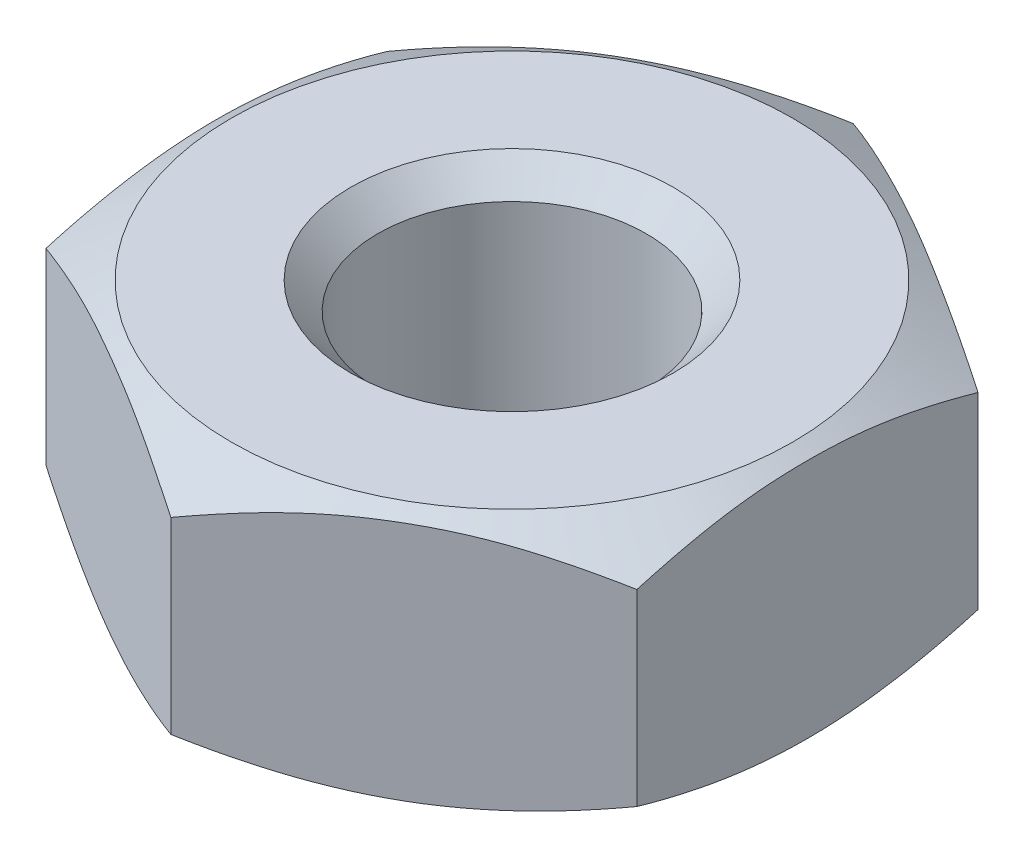
ISO-10303-21;
HEADER;
FILE_DESCRIPTION(('STEP AP214'),'2;1');
FILE_NAME('part.step','',(''),(''),'','','');
FILE_SCHEMA(('AUTOMOTIVE_DESIGN { 1 0 10303 214 1 1 1 1 }'));
ENDSEC;
DATA;
#1=APPLICATION_CONTEXT('core data for automotive mechanical design processes');
#2=APPLICATION_PROTOCOL_DEFINITION('international standard','automotive_design',2000,#1);
#3=PRODUCT_CONTEXT('',#1,'mechanical');
#4=PRODUCT('Part','Part','',(#3));
#5=PRODUCT_RELATED_PRODUCT_CATEGORY('part','',(#4));
#6=PRODUCT_DEFINITION_FORMATION('','',#4);
#7=PRODUCT_DEFINITION_CONTEXT('part definition',#1,'design');
#8=PRODUCT_DEFINITION('design','',#6,#7);
#9=PRODUCT_DEFINITION_SHAPE('','',#8);
#10=(LENGTH_UNIT() NAMED_UNIT(*) SI_UNIT(.MILLI.,.METRE.));
#11=(NAMED_UNIT(*) PLANE_ANGLE_UNIT() SI_UNIT($,.RADIAN.));
#12=(NAMED_UNIT(*) SI_UNIT($,.STERADIAN.) SOLID_ANGLE_UNIT());
#13=UNCERTAINTY_MEASURE_WITH_UNIT(LENGTH_MEASURE(1.E-05),#10,'distance_accuracy_value','');
#14=(GEOMETRIC_REPRESENTATION_CONTEXT(3) GLOBAL_UNCERTAINTY_ASSIGNED_CONTEXT((#13)) GLOBAL_UNIT_ASSIGNED_CONTEXT((#10,
#11,#12)) REPRESENTATION_CONTEXT('',''));
#15=CARTESIAN_POINT('',(0.,0.,0.));
#16=DIRECTION('',(0.,0.,1.));
#17=DIRECTION('',(1.,0.,0.));
#18=AXIS2_PLACEMENT_3D('',#15,#16,#17);
#19=CARTESIAN_POINT('',(2.75,0.,1.587713240271));
#20=DIRECTION('',(1.,0.,0.));
#21=DIRECTION('',(0.,1.,0.));
#22=AXIS2_PLACEMENT_3D('',#19,#20,#21);
#23=PLANE('',#22);
#24=DIRECTION('',(0.,1.,0.));
#25=VECTOR('',#24,1.);
#26=CARTESIAN_POINT('',(2.75000000001,0.3250057550854,1.587713240281));
#27=LINE('',#26,#25);
#28=CARTESIAN_POINT('',(2.75,0.3250057550754,1.587713240271));
#29=VERTEX_POINT('',#28);
#30=CARTESIAN_POINT('',(2.75,2.074994244925,1.587713240271));
#31=VERTEX_POINT('',#30);
#32=EDGE_CURVE('E41',#29,#31,#27,.T.);
#33=ORIENTED_EDGE('',*,*,#32,.F.);
#34=CARTESIAN_POINT('',(2.75,0.3250057550854,1.587713240281));
#35=CARTESIAN_POINT('',(2.75,0.202432964709957,1.16310863917238));
#36=CARTESIAN_POINT('',(2.75,0.141995276004106,0.779836988622892));
#37=CARTESIAN_POINT('',(2.75,0.0794641483916763,0.38328958577));
#38=CARTESIAN_POINT('',(2.75,0.079391833422988,0.));
#39=CARTESIAN_POINT('',(2.75,0.0793198580882929,-0.38148943049256));
#40=CARTESIAN_POINT('',(2.75,0.142034718955519,-0.780084679138575));
#41=CARTESIAN_POINT('',(2.75,0.20213982434293,-1.16209317115311));
#42=CARTESIAN_POINT('',(2.75,0.3250057550854,-1.587713240281));
#43=B_SPLINE_CURVE_WITH_KNOTS('',2,(#34,#35,#36,#37,#38,#39,#40,#41,#42),.UNSPECIFIED.,.F.,.F.,
(3,2,2,2,3),(0.,0.25,0.5,0.75,1.),.UNSPECIFIED.);
#44=CARTESIAN_POINT('',(2.75,0.3250057550754,-1.587713240271));
#45=VERTEX_POINT('',#44);
#46=EDGE_CURVE('E11',#29,#45,#43,.T.);
#47=ORIENTED_EDGE('',*,*,#46,.T.);
#48=DIRECTION('',(0.,1.,0.));
#49=VECTOR('',#48,1.);
#50=CARTESIAN_POINT('',(2.75000000001,0.3250057550854,-1.587713240281));
#51=LINE('',#50,#49);
#52=CARTESIAN_POINT('',(2.75,2.074994244925,-1.587713240271));
#53=VERTEX_POINT('',#52);
#54=EDGE_CURVE('E31',#45,#53,#51,.T.);
#55=ORIENTED_EDGE('',*,*,#54,.T.);
#56=CARTESIAN_POINT('',(2.74999999128452,2.07499422748405,1.58771323524335));
#57=CARTESIAN_POINT('',(2.75026924419332,2.0950517669424,1.51775006464995));
#58=CARTESIAN_POINT('',(2.75031743477077,2.11429358889751,1.44754296139929));
#59=CARTESIAN_POINT('',(2.75016073239949,2.15014362364269,1.30917614943761));
#60=CARTESIAN_POINT('',(2.74996495720855,2.16682205356569,1.24103456220994));
#61=CARTESIAN_POINT('',(2.74950953728605,2.19755391170657,1.10640623662916));
#62=CARTESIAN_POINT('',(2.74925208963847,2.21167329075243,1.03993467109337));
#63=CARTESIAN_POINT('',(2.74881881165998,2.23729045799972,0.90820653320835));
#64=CARTESIAN_POINT('',(2.74864110441468,2.24884488851676,0.842961050695181));
#65=CARTESIAN_POINT('',(2.74845083193915,2.26934378666009,0.713195722113406));
#66=CARTESIAN_POINT('',(2.74843550930952,2.27832930313306,0.648682408770343));
#67=CARTESIAN_POINT('',(2.74857872189258,2.29370818721281,0.519848842514658));
#68=CARTESIAN_POINT('',(2.74873592238204,2.30012093817181,0.455530913880747));
#69=CARTESIAN_POINT('',(2.74914812054111,2.31037706255383,0.326518511798419));
#70=CARTESIAN_POINT('',(2.74940337688466,2.31421356557101,0.261823491955182));
#71=CARTESIAN_POINT('',(2.74983109216155,2.31934811782021,0.13146051054192));
#72=CARTESIAN_POINT('',(2.75000238888214,2.32061125978377,0.0657911870760246));
#73=CARTESIAN_POINT('',(2.75000294166434,2.32061428398817,-0.0653518336409079));
#74=CARTESIAN_POINT('',(2.74983321604558,2.31936167845436,-0.13082553036676));
#75=CARTESIAN_POINT('',(2.7494411179775,2.31424296203845,-0.260854618884632));
#76=CARTESIAN_POINT('',(2.7492194279927,2.3104096161718,-0.325411286168579));
#77=CARTESIAN_POINT('',(2.74888257041347,2.30016131103028,-0.454205149844191));
#78=CARTESIAN_POINT('',(2.74876721666765,2.2937508915307,-0.518442707972161));
#79=CARTESIAN_POINT('',(2.74870648248435,2.27837650616623,-0.647174495889766));
#80=CARTESIAN_POINT('',(2.74876258329119,2.26939089847432,-0.711666127813049));
#81=CARTESIAN_POINT('',(2.74902031774506,2.24889195105121,-0.841447904794925));
#82=CARTESIAN_POINT('',(2.74922458392745,2.23733554587004,-0.906731194436827));
#83=CARTESIAN_POINT('',(2.74968493901144,2.21171410743799,-1.03859557577446));
#84=CARTESIAN_POINT('',(2.74994225690861,2.19759075083289,-1.10516525938946));
#85=CARTESIAN_POINT('',(2.75035848553218,2.1668503704069,-1.24005122978069));
#86=CARTESIAN_POINT('',(2.75051384313673,2.15016609213888,-1.30835207294491));
#87=CARTESIAN_POINT('',(2.75053785660167,2.11430300035224,-1.4470991158237));
#88=CARTESIAN_POINT('',(2.75039527346869,2.09505299636517,-1.51752697770114));
#89=CARTESIAN_POINT('',(2.74999999128452,2.07499422748405,-1.58771323524335));
#90=B_SPLINE_CURVE_WITH_KNOTS('',3,(#56,#57,#58,#59,#60,#61,#62,#63,#64,#65,#66,#67,#68,#69,#70,
#71,#72,#73,#74,#75,#76,#77,#78,#79,#80,#81,#82,#83,#84,#85,#86,#87,#88,#89),.UNSPECIFIED.,.F.,
.F.,(4,2,2,2,2,2,2,2,2,2,2,2,2,2,2,2,4),(0.,0.218353911222963,0.428786539417434,
0.632615578700071,0.831356640650916,1.02671742750199,1.22057739483245,1.41495232135759,
1.61194681703093,1.80835394581791,2.00231337616111,2.19593261421896,2.39122929791552,
2.59008367564735,2.7942035205356,3.00510434639758,3.22410416106754),.UNSPECIFIED.);
#91=EDGE_CURVE('E353',#31,#53,#90,.T.);
#92=ORIENTED_EDGE('',*,*,#91,.F.);
#93=EDGE_LOOP('',(#33,#47,#55,#92));
#94=FACE_BOUND('',#93,.T.);
#95=ADVANCED_FACE('F17',(#94),#23,.T.);
#96=CARTESIAN_POINT('',(0.,0.1625028775377,0.));
#97=DIRECTION('',(0.,1.,0.));
#98=DIRECTION('',(0.866025403784429,0.,0.500000000000017));
#99=AXIS2_PLACEMENT_3D('',#96,#97,#98);
#100=CONICAL_SURFACE('',#99,2.8939632,1.0471975512);
#101=CARTESIAN_POINT('',(-2.75,0.3250057550854,-1.587713240281));
#102=CARTESIAN_POINT('',(-2.75,0.202432964709957,-1.16310863917238));
#103=CARTESIAN_POINT('',(-2.75,0.141995276004106,-0.779836988622892));
#104=CARTESIAN_POINT('',(-2.75,0.0794641483916763,-0.38328958577));
#105=CARTESIAN_POINT('',(-2.75,0.079391833422988,0.));
#106=CARTESIAN_POINT('',(-2.75,0.0793198580882929,0.38148943049256));
#107=CARTESIAN_POINT('',(-2.75,0.142034718955519,0.780084679138575));
#108=CARTESIAN_POINT('',(-2.75,0.20213982434293,1.16209317115311));
#109=CARTESIAN_POINT('',(-2.75,0.3250057550854,1.587713240281));
#110=B_SPLINE_CURVE_WITH_KNOTS('',2,(#101,#102,#103,#104,#105,#106,#107,#108,#109),
.UNSPECIFIED.,.F.,.F.,(3,2,2,2,3),(0.,0.25,0.5,0.75,1.),.UNSPECIFIED.);
#111=CARTESIAN_POINT('',(-2.75,0.3250057550754,-1.587713240271));
#112=VERTEX_POINT('',#111);
#113=CARTESIAN_POINT('',(-2.75,0.3250057550754,1.587713240271));
#114=VERTEX_POINT('',#113);
#115=EDGE_CURVE('E86',#112,#114,#110,.T.);
#116=ORIENTED_EDGE('',*,*,#115,.F.);
#117=CARTESIAN_POINT('',(4.33020176524475E-12,0.3250057550854,-3.1754264805455));
#118=CARTESIAN_POINT('',(-0.36771837117246,0.202432964701767,-2.9631241799606));
#119=CARTESIAN_POINT('',(-0.699641357053544,0.141995276004106,-2.77148835471192));
#120=CARTESIAN_POINT('',(-1.0430614818358,0.0794641483721747,-2.57321465322374));
#121=CARTESIAN_POINT('',(-1.37513819265072,0.0793918334229927,-2.38149007484313));
#122=CARTESIAN_POINT('',(-1.70537995413911,0.0793199180630109,-2.19082490495015));
#123=CARTESIAN_POINT('',(-2.05057314923139,0.142034718955519,-1.99152752084118));
#124=CARTESIAN_POINT('',(-2.38140230645626,0.202139857236843,-1.80052321786162));
#125=CARTESIAN_POINT('',(-2.75000000000337,0.3250057550854,-1.58771324026951));
#126=B_SPLINE_CURVE_WITH_KNOTS('',2,(#117,#118,#119,#120,#121,#122,#123,#124,#125),
.UNSPECIFIED.,.F.,.F.,(3,2,2,2,3),(0.,0.25,0.5,0.75,1.),.UNSPECIFIED.);
#127=CARTESIAN_POINT('',(0.,0.3250057550754,-3.175426480543));
#128=VERTEX_POINT('',#127);
#129=EDGE_CURVE('E129',#128,#112,#126,.T.);
#130=ORIENTED_EDGE('',*,*,#129,.F.);
#131=CARTESIAN_POINT('',(2.75000000000317,0.3250057550854,-1.58771324026917));
#132=CARTESIAN_POINT('',(2.38228162887582,0.202432964709482,-1.80001554082552));
#133=CARTESIAN_POINT('',(2.05035864295268,0.141995276004106,-1.99165136609848));
#134=CARTESIAN_POINT('',(1.70693851817055,0.0794641483721382,-2.18992506758659));
#135=CARTESIAN_POINT('',(1.3748618073554,0.079391833422988,-2.38164964596733));
#136=CARTESIAN_POINT('',(1.0446200458664,0.0793199180630378,-2.57231481586067));
#137=CARTESIAN_POINT('',(0.699426850774542,0.142034718955519,-2.77161219996939));
#138=CARTESIAN_POINT('',(0.368597693586223,0.202139857230251,-2.96261650292785));
#139=CARTESIAN_POINT('',(-4.53196508098941E-12,0.3250057550854,-3.17542648054516));
#140=B_SPLINE_CURVE_WITH_KNOTS('',2,(#131,#132,#133,#134,#135,#136,#137,#138,#139),
.UNSPECIFIED.,.F.,.F.,(3,2,2,2,3),(0.,0.25,0.5,0.75,1.),.UNSPECIFIED.);
#141=EDGE_CURVE('E229',#45,#128,#140,.T.);
#142=ORIENTED_EDGE('',*,*,#141,.F.);
#143=ORIENTED_EDGE('',*,*,#46,.F.);
#144=CARTESIAN_POINT('',(-4.33020176524475E-12,0.3250057550854,3.1754264805455));
#145=CARTESIAN_POINT('',(0.367718371172447,0.20243296470177,2.96312417996061));
#146=CARTESIAN_POINT('',(0.699641357053544,0.141995276004106,2.77148835471192));
#147=CARTESIAN_POINT('',(1.04306148183593,0.07946414837215,2.57321465322367));
#148=CARTESIAN_POINT('',(1.37513819265072,0.079391833422988,2.38149007484313));
#149=CARTESIAN_POINT('',(1.70537995413929,0.0793199180630261,2.19082490495005));
#150=CARTESIAN_POINT('',(2.05057314923139,0.142034718955519,1.99152752084118));
#151=CARTESIAN_POINT('',(2.38140230645636,0.202139857236878,1.80052321786156));
#152=CARTESIAN_POINT('',(2.75000000000337,0.3250057550854,1.58771324026951));
#153=B_SPLINE_CURVE_WITH_KNOTS('',2,(#144,#145,#146,#147,#148,#149,#150,#151,#152),
.UNSPECIFIED.,.F.,.F.,(3,2,2,2,3),(0.,0.25,0.5,0.75,1.),.UNSPECIFIED.);
#154=CARTESIAN_POINT('',(0.,0.3250057550754,3.175426480543));
#155=VERTEX_POINT('',#154);
#156=EDGE_CURVE('E78',#155,#29,#153,.T.);
#157=ORIENTED_EDGE('',*,*,#156,.F.);
#158=CARTESIAN_POINT('',(-2.75000000000317,0.3250057550854,1.58771324026917));
#159=CARTESIAN_POINT('',(-2.38228162887582,0.202432964709482,1.80001554082552));
#160=CARTESIAN_POINT('',(-2.05035864295268,0.141995276004106,1.99165136609848));
#161=CARTESIAN_POINT('',(-1.70693851817055,0.0794641483721382,2.18992506758659));
#162=CARTESIAN_POINT('',(-1.3748618073554,0.079391833422988,2.38164964596733));
#163=CARTESIAN_POINT('',(-1.0446200458664,0.0793199180630378,2.57231481586067));
#164=CARTESIAN_POINT('',(-0.699426850774542,0.142034718955519,2.77161219996939));
#165=CARTESIAN_POINT('',(-0.368597693586223,0.202139857230251,2.96261650292785));
#166=CARTESIAN_POINT('',(4.53196508098941E-12,0.3250057550854,3.17542648054516));
#167=B_SPLINE_CURVE_WITH_KNOTS('',2,(#158,#159,#160,#161,#162,#163,#164,#165,#166),
.UNSPECIFIED.,.F.,.F.,(3,2,2,2,3),(0.,0.25,0.5,0.75,1.),.UNSPECIFIED.);
#168=EDGE_CURVE('E247',#114,#155,#167,.T.);
#169=ORIENTED_EDGE('',*,*,#168,.F.);
#170=EDGE_LOOP('',(#116,#130,#142,#143,#157,#169));
#171=FACE_BOUND('',#170,.T.);
#172=CARTESIAN_POINT('',(0.,0.,0.));
#173=DIRECTION('',(0.,1.,0.));
#174=DIRECTION('',(-0.866025403783729,0.,-0.50000000000123));
#175=AXIS2_PLACEMENT_3D('',#172,#173,#174);
#176=CIRCLE('',#175,2.6125);
#177=CARTESIAN_POINT('',(-2.26249136738499,0.,-1.30625000000321));
#178=VERTEX_POINT('',#177);
#179=EDGE_CURVE('E358',#178,#178,#176,.T.);
#180=ORIENTED_EDGE('',*,*,#179,.T.);
#181=EDGE_LOOP('',(#180));
#182=FACE_BOUND('',#181,.T.);
#183=ADVANCED_FACE('F158',(#171,#182),#100,.T.);
#184=CARTESIAN_POINT('',(0.,2.237497122462,0.));
#185=DIRECTION('',(0.,-1.,0.));
#186=DIRECTION('',(-0.866025403784429,0.,-0.500000000000017));
#187=AXIS2_PLACEMENT_3D('',#184,#185,#186);
#188=CONICAL_SURFACE('',#187,2.8939632,1.0471975512);
#189=CARTESIAN_POINT('',(0.,2.07499422748551,3.17542647047852));
#190=CARTESIAN_POINT('',(0.0607271359789957,2.0950526354229,3.14067656049189));
#191=CARTESIAN_POINT('',(0.121555031924663,2.11429523281057,3.10561324972053));
#192=CARTESIAN_POINT('',(0.241311213933353,2.15014659192865,3.03629118703554));
#193=CARTESIAN_POINT('',(0.300228362968519,2.16682557687211,3.00204939107935));
#194=CARTESIAN_POINT('',(0.416597653195168,2.19755831948353,2.93433791101815));
#195=CARTESIAN_POINT('',(0.474037751655115,2.21167803199569,2.90087771528976));
#196=CARTESIAN_POINT('',(0.587906651856942,2.23729564340729,2.83463545199916));
#197=CARTESIAN_POINT('',(0.644324911166082,2.24885018526791,2.80185730364598));
#198=CARTESIAN_POINT('',(0.756615735235586,2.26934908601108,2.73680672824999));
#199=CARTESIAN_POINT('',(0.812481265069499,2.27833448981637,2.70453517987109));
#200=CARTESIAN_POINT('',(0.924132250725476,2.29371293741646,2.64023897734769));
#201=CARTESIAN_POINT('',(0.97991502812661,2.30012535521167,2.6082143299673));
#202=CARTESIAN_POINT('',(1.0918558203737,2.31038059307584,2.54406117881997));
#203=CARTESIAN_POINT('',(1.14801443879402,2.31421652801255,2.51193262550704));
#204=CARTESIAN_POINT('',(1.26113309055075,2.31934978388391,2.44711686377083));
#205=CARTESIAN_POINT('',(1.31809372015405,2.32061217911375,2.41442796371892));
#206=CARTESIAN_POINT('',(1.43166676326288,2.32061336942619,2.34885620013811));
#207=CARTESIAN_POINT('',(1.48827970874451,2.3193600189284,2.31597425888707));
#208=CARTESIAN_POINT('',(1.60068452968266,2.31424000957252,2.25062398864963));
#209=CARTESIAN_POINT('',(1.65647784861984,2.31040609725881,2.21815560951547));
#210=CARTESIAN_POINT('',(1.76784144056586,2.30015690803488,2.15347076608406));
#211=CARTESIAN_POINT('',(1.82341193299552,2.2937461562929,2.12125396058142));
#212=CARTESIAN_POINT('',(1.93486045952341,2.27837133554085,2.05683914538258));
#213=CARTESIAN_POINT('',(1.99073698399884,2.26938561549179,2.02464371932352));
#214=CARTESIAN_POINT('',(2.10325450871686,2.24888667048008,1.95997956759657));
#215=CARTESIAN_POINT('',(2.15989088786003,2.23733037630207,1.92751655070375));
#216=CARTESIAN_POINT('',(2.27431358720892,2.21170938055318,1.86198642755927));
#217=CARTESIAN_POINT('',(2.3320906419453,2.19758635641734,1.82892608960007));
#218=CARTESIAN_POINT('',(2.44910818564692,2.16684685768322,1.7618468344947));
#219=CARTESIAN_POINT('',(2.50833352344406,2.15016313276913,1.72783256056984));
#220=CARTESIAN_POINT('',(2.62849876290985,2.1143013613043,1.65848300730283));
#221=CARTESIAN_POINT('',(2.68941716432042,2.09505213044806,1.62314716117531));
#222=CARTESIAN_POINT('',(2.74999999128452,2.07499422748405,1.58771323524335));
#223=B_SPLINE_CURVE_WITH_KNOTS('',3,(#189,#190,#191,#192,#193,#194,#195,#196,#197,#198,#199,
#200,#201,#202,#203,#204,#205,#206,#207,#208,#209,#210,#211,#212,#213,#214,#215,#216,#217,#218,
#219,#220,#221,#222),.UNSPECIFIED.,.F.,.F.,(4,2,2,2,2,2,2,2,2,2,2,2,2,2,2,2,4),(0.,
0.21836336004193,0.428805291151602,0.632643676831476,0.831394352435065,1.02676527384233,
1.22063617194621,1.41502311142939,1.61203098713595,1.80842474050765,2.00237216013665,
2.19598046785784,2.39126701613141,2.59011177860151,2.7942222754074,3.00511379734537,
3.22410416365351),.UNSPECIFIED.);
#224=CARTESIAN_POINT('',(0.,2.074994244925,3.175426480543));
#225=VERTEX_POINT('',#224);
#226=EDGE_CURVE('E347',#225,#31,#223,.T.);
#227=ORIENTED_EDGE('',*,*,#226,.T.);
#228=ORIENTED_EDGE('',*,*,#91,.T.);
#229=CARTESIAN_POINT('',(2.74999999128452,2.07499422748405,-1.58771323524335));
#230=CARTESIAN_POINT('',(2.68954211846859,2.09505263542169,-1.62292952270383));
#231=CARTESIAN_POINT('',(2.62876245262835,2.11429523280952,-1.65807637046315));
#232=CARTESIAN_POINT('',(2.50884969429862,2.1501465919279,-1.72712723499604));
#233=CARTESIAN_POINT('',(2.44973685461293,2.16682557687148,-1.76103008479926));
#234=CARTESIAN_POINT('',(2.33291234764075,2.19755831948314,-1.8279531063228));
#235=CARTESIAN_POINT('',(2.27521491889522,2.2116780319954,-1.86096759291998));
#236=CARTESIAN_POINT('',(2.16091298598173,2.23729564340718,-1.92645982154956));
#237=CARTESIAN_POINT('',(2.1043171471647,2.24885018526786,-1.95893039317189));
#238=CARTESIAN_POINT('',(1.99183628430657,2.26934908601114,-2.02365181173039));
#239=CARTESIAN_POINT('',(1.93595553867395,2.27833448981647,-2.0558970055735));
#240=CARTESIAN_POINT('',(1.82444790109308,2.29371293741661,-2.12044149424892));
#241=CARTESIAN_POINT('',(1.76882235421319,2.30012535521182,-2.15273847288272));
#242=CARTESIAN_POINT('',(1.65729369946126,2.31038059307599,-2.21760546711709));
#243=CARTESIAN_POINT('',(1.60139024689393,2.31421652801266,-2.25017598065539));
#244=CARTESIAN_POINT('',(1.48869882478293,2.31934978388398,-2.31573172585325));
#245=CARTESIAN_POINT('',(1.43190909211243,2.32061217911379,-2.34871662808077));
#246=CARTESIAN_POINT('',(1.31833575752566,2.32061336942601,-2.41428788680835));
#247=CARTESIAN_POINT('',(1.26155268833738,2.3193600189282,-2.44687516515218));
#248=CARTESIAN_POINT('',(1.14875528370151,2.31424000957229,-2.51154546047259));
#249=CARTESIAN_POINT('',(1.09274018308434,2.31040609725855,-2.5436297024662));
#250=CARTESIAN_POINT('',(0.981039669462059,2.30015690803461,-2.60773098043201));
#251=CARTESIAN_POINT('',(0.925353851253998,2.29374615629264,-2.63974803582551));
#252=CARTESIAN_POINT('',(0.813844721648915,2.27837133554065,-2.70405788341362));
#253=CARTESIAN_POINT('',(0.758024402558717,2.26938561549164,-2.7363506600551));
#254=CARTESIAN_POINT('',(0.645764842090056,2.24888667048006,-2.80146161896867));
#255=CARTESIAN_POINT('',(0.589332855205558,2.23733037630211,-2.8342786536388));
#256=CARTESIAN_POINT('',(0.47537075417376,2.21170938055342,-2.90060655647263));
#257=CARTESIAN_POINT('',(0.417851134274335,2.19758635641768,-2.93411278465074));
#258=CARTESIAN_POINT('',(0.301250023432939,2.16684685768381,-3.00191332263231));
#259=CARTESIAN_POINT('',(0.242180129222614,2.15016313276987,-3.03619683274994));
#260=CARTESIAN_POINT('',(0.122039034615595,2.11430136130535,-3.10558820614549));
#261=CARTESIAN_POINT('',(0.0609780934973909,2.09505213044928,-3.14067716626099));
#262=CARTESIAN_POINT('',(0.,2.07499422748551,-3.17542647047852));
#263=B_SPLINE_CURVE_WITH_KNOTS('',3,(#229,#230,#231,#232,#233,#234,#235,#236,#237,#238,#239,
#240,#241,#242,#243,#244,#245,#246,#247,#248,#249,#250,#251,#252,#253,#254,#255,#256,#257,#258,
#259,#260,#261,#262),.UNSPECIFIED.,.F.,.F.,(4,2,2,2,2,2,2,2,2,2,2,2,2,2,2,2,4),(0.,
0.218363360034661,0.428805291139053,0.632643676815675,0.831394352418089,1.02676527382632,
1.22063617193336,1.41502311142196,1.61203098713623,1.80842474050232,2.00237216012739,
2.19598046784632,2.39126701611922,2.59011177859019,2.79422227539845,3.00511379734024,
3.22410416365363),.UNSPECIFIED.);
#264=CARTESIAN_POINT('',(0.,2.074994244925,-3.175426480543));
#265=VERTEX_POINT('',#264);
#266=EDGE_CURVE('E117',#53,#265,#263,.T.);
#267=ORIENTED_EDGE('',*,*,#266,.T.);
#268=CARTESIAN_POINT('',(0.,2.07499422748551,-3.17542647047852));
#269=CARTESIAN_POINT('',(-0.0607271359793591,2.095052635423,-3.14067656049172));
#270=CARTESIAN_POINT('',(-0.12155503192538,2.11429523281077,-3.10561324972016));
#271=CARTESIAN_POINT('',(-0.241311213934654,2.15014659192904,-3.03629118703477));
#272=CARTESIAN_POINT('',(-0.300228362970049,2.16682557687257,-3.0020493910784));
#273=CARTESIAN_POINT('',(-0.416597653197053,2.19755831948411,-2.93433791101687));
#274=CARTESIAN_POINT('',(-0.474037751657125,2.21167803199631,-2.90087771528834));
#275=CARTESIAN_POINT('',(-0.587906651859114,2.23729564340797,-2.83463545199751));
#276=CARTESIAN_POINT('',(-0.64432491116829,2.24885018526861,-2.80185730364423));
#277=CARTESIAN_POINT('',(-0.756615735237799,2.26934908601178,-2.73680672824812));
#278=CARTESIAN_POINT('',(-0.812481265071679,2.27833448981706,-2.7045351798692));
#279=CARTESIAN_POINT('',(-0.92413225072754,2.29371293741709,-2.64023897734581));
#280=CARTESIAN_POINT('',(-0.979915028128592,2.30012535521225,-2.60821432996547));
#281=CARTESIAN_POINT('',(-1.09185582037548,2.31038059307631,-2.54406117881832));
#282=CARTESIAN_POINT('',(-1.14801443879568,2.31421652801295,-2.51193262550551));
#283=CARTESIAN_POINT('',(-1.26113309055217,2.31934978388413,-2.44711686376967));
#284=CARTESIAN_POINT('',(-1.31809372015535,2.32061217911385,-2.414427963718));
#285=CARTESIAN_POINT('',(-1.43166676326433,2.32061336942608,-2.34885620013745));
#286=CARTESIAN_POINT('',(-1.48827970874623,2.31936001892818,-2.31597425888641));
#287=CARTESIAN_POINT('',(-1.60068452968486,2.31424000957211,-2.25062398864892));
#288=CARTESIAN_POINT('',(-1.65647784862224,2.31040609725834,-2.2181556095147));
#289=CARTESIAN_POINT('',(-1.7678414405686,2.30015690803429,-2.15347076608313));
#290=CARTESIAN_POINT('',(-1.82341193299839,2.29374615629227,-2.1212539605804));
#291=CARTESIAN_POINT('',(-1.93486045952648,2.27837133554016,-2.05683914538133));
#292=CARTESIAN_POINT('',(-1.99073698400197,2.26938561549109,-2.02464371932216));
#293=CARTESIAN_POINT('',(-2.10325450872004,2.24888667047938,-1.95997956759494));
#294=CARTESIAN_POINT('',(-2.15989088786319,2.23733037630138,-1.92751655070199));
#295=CARTESIAN_POINT('',(-2.27431358721197,2.21170938055255,-1.86198642755726));
#296=CARTESIAN_POINT('',(-2.33209064194826,2.19758635641676,-1.82892608959793));
#297=CARTESIAN_POINT('',(-2.44910818564961,2.16684685768276,-1.76184683449233));
#298=CARTESIAN_POINT('',(-2.50833352344658,2.15016313276874,-1.72783256056736));
#299=CARTESIAN_POINT('',(-2.62849876291195,2.11430136130409,-1.65848300730019));
#300=CARTESIAN_POINT('',(-2.68941716432226,2.09505213044796,-1.62314716117259));
#301=CARTESIAN_POINT('',(-2.74999999128612,2.07499422748405,-1.58771323524058));
#302=B_SPLINE_CURVE_WITH_KNOTS('',3,(#268,#269,#270,#271,#272,#273,#274,#275,#276,#277,#278,
#279,#280,#281,#282,#283,#284,#285,#286,#287,#288,#289,#290,#291,#292,#293,#294,#295,#296,#297,
#298,#299,#300,#301),.UNSPECIFIED.,.F.,.F.,(4,2,2,2,2,2,2,2,2,2,2,2,2,2,2,2,4),(0.,
0.218363360043195,0.428805291153767,0.6326436768342,0.831394352438027,1.02676527384524,
1.22063617194882,1.41502311143148,1.61203098713736,1.80842474050977,2.0023721601394,
2.1959804678611,2.39126701613501,2.59011177860526,2.79422227541107,3.0051137973487,
3.22410416365623),.UNSPECIFIED.);
#303=CARTESIAN_POINT('',(-2.75,2.074994244925,-1.587713240271));
#304=VERTEX_POINT('',#303);
#305=EDGE_CURVE('E107',#265,#304,#302,.T.);
#306=ORIENTED_EDGE('',*,*,#305,.T.);
#307=CARTESIAN_POINT('',(-2.74999999128611,2.07499422748405,-1.58771323524059));
#308=CARTESIAN_POINT('',(-2.7502692441948,2.0950517669425,-1.51775006464693));
#309=CARTESIAN_POINT('',(-2.75031743477212,2.11429358889771,-1.44754296139601));
#310=CARTESIAN_POINT('',(-2.75016073240054,2.15014362364306,-1.30917614943392));
#311=CARTESIAN_POINT('',(-2.74996495720944,2.16682205356613,-1.2410345622061));
#312=CARTESIAN_POINT('',(-2.74950953728663,2.19755391170713,-1.10640623662511));
#313=CARTESIAN_POINT('',(-2.74925208963889,2.21167329075304,-1.03993467108928));
#314=CARTESIAN_POINT('',(-2.74881881166012,2.23729045800039,-0.908206533204242));
#315=CARTESIAN_POINT('',(-2.74864110441469,2.24884488851744,-0.842961050691114));
#316=CARTESIAN_POINT('',(-2.74845083193894,2.26934378666077,-0.713195722109503));
#317=CARTESIAN_POINT('',(-2.74843550930922,2.27832930313374,-0.648682408766564));
#318=CARTESIAN_POINT('',(-2.74857872189214,2.29370818721342,-0.5198488425112));
#319=CARTESIAN_POINT('',(-2.74873592238158,2.30012093817238,-0.455530913877486));
#320=CARTESIAN_POINT('',(-2.74914812054064,2.31037706255429,-0.326518511795616));
#321=CARTESIAN_POINT('',(-2.74940337688422,2.3142135655714,-0.261823491952639));
#322=CARTESIAN_POINT('',(-2.74983109216127,2.31934811782042,-0.131460510539951));
#323=CARTESIAN_POINT('',(-2.75000238888199,2.32061125978387,-0.0657911870743676));
#324=CARTESIAN_POINT('',(-2.75000294166448,2.32061428398807,0.0653518336424219));
#325=CARTESIAN_POINT('',(-2.74983321604587,2.31936167845415,0.130825530368443));
#326=CARTESIAN_POINT('',(-2.74944111797799,2.31424296203806,0.26085461888661));
#327=CARTESIAN_POINT('',(-2.74921942799325,2.31040961617134,0.325411286170682));
#328=CARTESIAN_POINT('',(-2.74888257041409,2.30016131102971,0.454205149846488));
#329=CARTESIAN_POINT('',(-2.74876721666828,2.29375089153009,0.518442707974528));
#330=CARTESIAN_POINT('',(-2.74870648248497,2.27837650616556,0.647174495892207));
#331=CARTESIAN_POINT('',(-2.74876258329177,2.26939089847364,0.711666127815495));
#332=CARTESIAN_POINT('',(-2.74902031774557,2.24889195105053,0.841447904797306));
#333=CARTESIAN_POINT('',(-2.74922458392789,2.23733554586938,0.906731194439137));
#334=CARTESIAN_POINT('',(-2.74968493901178,2.21171410743739,1.03859557577655));
#335=CARTESIAN_POINT('',(-2.74994225690888,2.19759075083233,1.10516525939139));
#336=CARTESIAN_POINT('',(-2.75035848553234,2.16685037040645,1.24005122978222));
#337=CARTESIAN_POINT('',(-2.75051384313684,2.15016609213851,1.30835207294619));
#338=CARTESIAN_POINT('',(-2.7505378566017,2.11430300035204,1.44709911582438));
#339=CARTESIAN_POINT('',(-2.75039527346869,2.09505299636507,1.51752697770147));
#340=CARTESIAN_POINT('',(-2.74999999128453,2.07499422748405,1.58771323524333));
#341=B_SPLINE_CURVE_WITH_KNOTS('',3,(#307,#308,#309,#310,#311,#312,#313,#314,#315,#316,#317,
#318,#319,#320,#321,#322,#323,#324,#325,#326,#327,#328,#329,#330,#331,#332,#333,#334,#335,#336,
#337,#338,#339,#340),.UNSPECIFIED.,.F.,.F.,(4,2,2,2,2,2,2,2,2,2,2,2,2,2,2,2,4),(0.,
0.218353911223797,0.428786539418761,0.63261557870158,0.831356640652314,1.02671742750301,
1.22057739483287,1.41495232135722,1.61194681702961,1.80835394581711,2.0023133761607,
2.19593261421877,2.39122929791534,2.59008367564696,2.79420352053472,3.00510434639593,
3.2241041610648),.UNSPECIFIED.);
#342=CARTESIAN_POINT('',(-2.75,2.074994244925,1.587713240271));
#343=VERTEX_POINT('',#342);
#344=EDGE_CURVE('E96',#304,#343,#341,.T.);
#345=ORIENTED_EDGE('',*,*,#344,.T.);
#346=CARTESIAN_POINT('',(-2.74999999128453,2.07499422748405,1.58771323524333));
#347=CARTESIAN_POINT('',(-2.68954211846861,2.0950526354217,1.62292952270377));
#348=CARTESIAN_POINT('',(-2.62876245262841,2.11429523280952,1.65807637046306));
#349=CARTESIAN_POINT('',(-2.50884969429871,2.1501465919279,1.7271272349959));
#350=CARTESIAN_POINT('',(-2.44973685461304,2.16682557687148,1.7610300847991));
#351=CARTESIAN_POINT('',(-2.3329123476409,2.19755831948314,1.82795310632262));
#352=CARTESIAN_POINT('',(-2.27521491889538,2.2116780319954,1.86096759291979));
#353=CARTESIAN_POINT('',(-2.1609129859819,2.23729564340718,1.92645982154936));
#354=CARTESIAN_POINT('',(-2.10431714716488,2.24885018526786,1.95893039317169));
#355=CARTESIAN_POINT('',(-1.99183628430676,2.26934908601114,2.0236518117302));
#356=CARTESIAN_POINT('',(-1.93595553867414,2.27833448981647,2.05589700557332));
#357=CARTESIAN_POINT('',(-1.82444790109326,2.29371293741662,2.12044149424876));
#358=CARTESIAN_POINT('',(-1.76882235421336,2.30012535521183,2.15273847288259));
#359=CARTESIAN_POINT('',(-1.65729369946139,2.31038059307599,2.21760546711699));
#360=CARTESIAN_POINT('',(-1.60139024689405,2.31421652801266,2.2501759806553));
#361=CARTESIAN_POINT('',(-1.48869882478299,2.31934978388398,2.31573172585321));
#362=CARTESIAN_POINT('',(-1.43190909211247,2.32061217911379,2.34871662808075));
#363=CARTESIAN_POINT('',(-1.31833575752559,2.32061336942601,2.41428788680839));
#364=CARTESIAN_POINT('',(-1.26155268833724,2.3193600189282,2.44687516515225));
#365=CARTESIAN_POINT('',(-1.14875528370124,2.31424000957229,2.51154546047271));
#366=CARTESIAN_POINT('',(-1.09274018308401,2.31040609725855,2.54362970246634));
#367=CARTESIAN_POINT('',(-0.981039669461631,2.30015690803461,2.60773098043217));
#368=CARTESIAN_POINT('',(-0.925353851253532,2.29374615629265,2.63974803582567));
#369=CARTESIAN_POINT('',(-0.813844721648391,2.27837133554066,2.70405788341377));
#370=CARTESIAN_POINT('',(-0.758024402558174,2.26938561549164,2.73635066005524));
#371=CARTESIAN_POINT('',(-0.645764842089499,2.24888667048006,2.80146161896879));
#372=CARTESIAN_POINT('',(-0.589332855205005,2.23733037630212,2.83427865363891));
#373=CARTESIAN_POINT('',(-0.475370754173241,2.21170938055342,2.90060655647271));
#374=CARTESIAN_POINT('',(-0.417851134273846,2.19758635641768,2.93411278465081));
#375=CARTESIAN_POINT('',(-0.301250023432536,2.16684685768382,3.00191332263235));
#376=CARTESIAN_POINT('',(-0.24218012922227,2.15016313276987,3.03619683274997));
#377=CARTESIAN_POINT('',(-0.122039034615397,2.11430136130535,3.10558820614549));
#378=CARTESIAN_POINT('',(-0.0609780934972833,2.09505213044928,3.14067716626099));
#379=CARTESIAN_POINT('',(0.,2.07499422748551,3.17542647047852));
#380=B_SPLINE_CURVE_WITH_KNOTS('',3,(#346,#347,#348,#349,#350,#351,#352,#353,#354,#355,#356,
#357,#358,#359,#360,#361,#362,#363,#364,#365,#366,#367,#368,#369,#370,#371,#372,#373,#374,#375,
#376,#377,#378,#379),.UNSPECIFIED.,.F.,.F.,(4,2,2,2,2,2,2,2,2,2,2,2,2,2,2,2,4),(0.,
0.218363360034554,0.428805291138874,0.632643676815452,0.831394352417854,1.0267652738261,
1.22063617193319,1.41502311142186,1.61203098713624,1.80842474050258,2.00237216012783,
2.19598046784686,2.39126701611979,2.59011177859074,2.7942222753989,3.00511379734053,
3.22410416365368),.UNSPECIFIED.);
#381=EDGE_CURVE('E108',#343,#225,#380,.T.);
#382=ORIENTED_EDGE('',*,*,#381,.T.);
#383=EDGE_LOOP('',(#227,#228,#267,#306,#345,#382));
#384=FACE_BOUND('',#383,.T.);
#385=CARTESIAN_POINT('',(0.,2.40000000001,0.));
#386=DIRECTION('',(0.,1.,0.));
#387=DIRECTION('',(-0.866025403783729,0.,-0.50000000000123));
#388=AXIS2_PLACEMENT_3D('',#385,#386,#387);
#389=CIRCLE('',#388,2.6125);
#390=CARTESIAN_POINT('',(-2.26249136738499,2.40000000001,-1.30625000000321));
#391=VERTEX_POINT('',#390);
#392=EDGE_CURVE('E137',#391,#391,#389,.T.);
#393=ORIENTED_EDGE('',*,*,#392,.F.);
#394=EDGE_LOOP('',(#393));
#395=FACE_BOUND('',#394,.T.);
#396=ADVANCED_FACE('F114',(#384,#395),#188,.T.);
#397=CARTESIAN_POINT('',(0.,2.4,0.));
#398=DIRECTION('',(0.,1.,0.));
#399=DIRECTION('',(1.,0.,0.));
#400=AXIS2_PLACEMENT_3D('',#397,#398,#399);
#401=PLANE('',#400);
#402=ORIENTED_EDGE('',*,*,#392,.T.);
#403=EDGE_LOOP('',(#402));
#404=FACE_BOUND('',#403,.T.);
#405=CARTESIAN_POINT('',(0.,2.40000000001,0.));
#406=DIRECTION('',(0.,1.,0.));
#407=DIRECTION('',(-1.,0.,0.));
#408=AXIS2_PLACEMENT_3D('',#405,#406,#407);
#409=CIRCLE('',#408,1.5);
#410=CARTESIAN_POINT('',(-1.5,2.40000000001,0.));
#411=VERTEX_POINT('',#410);
#412=EDGE_CURVE('E346',#411,#411,#409,.T.);
#413=ORIENTED_EDGE('',*,*,#412,.F.);
#414=EDGE_LOOP('',(#413));
#415=FACE_BOUND('',#414,.T.);
#416=ADVANCED_FACE('F157',(#404,#415),#401,.T.);
#417=CARTESIAN_POINT('',(0.,0.,-3.175426480543));
#418=DIRECTION('',(-0.500000000000017,0.,-0.866025403784429));
#419=DIRECTION('',(-0.866025403784429,0.,0.500000000000017));
#420=AXIS2_PLACEMENT_3D('',#417,#418,#419);
#421=PLANE('',#420);
#422=DIRECTION('',(0.,1.,0.));
#423=VECTOR('',#422,1.);
#424=CARTESIAN_POINT('',(0.,0.3250057550854,-3.175426480553));
#425=LINE('',#424,#423);
#426=EDGE_CURVE('E201',#128,#265,#425,.T.);
#427=ORIENTED_EDGE('',*,*,#426,.F.);
#428=ORIENTED_EDGE('',*,*,#129,.T.);
#429=DIRECTION('',(0.,1.,0.));
#430=VECTOR('',#429,1.);
#431=CARTESIAN_POINT('',(-2.75000000001,0.3250057550854,-1.587713240281));
#432=LINE('',#431,#430);
#433=EDGE_CURVE('E101',#112,#304,#432,.T.);
#434=ORIENTED_EDGE('',*,*,#433,.T.);
#435=ORIENTED_EDGE('',*,*,#305,.F.);
#436=EDGE_LOOP('',(#427,#428,#434,#435));
#437=FACE_BOUND('',#436,.T.);
#438=ADVANCED_FACE('F127',(#437),#421,.T.);
#439=CARTESIAN_POINT('',(0.,0.,0.));
#440=DIRECTION('',(0.,1.,0.));
#441=DIRECTION('',(1.,0.,0.));
#442=AXIS2_PLACEMENT_3D('',#439,#440,#441);
#443=PLANE('',#442);
#444=ORIENTED_EDGE('',*,*,#179,.F.);
#445=EDGE_LOOP('',(#444));
#446=FACE_BOUND('',#445,.T.);
#447=CARTESIAN_POINT('',(0.,0.,0.));
#448=DIRECTION('',(0.,1.,0.));
#449=DIRECTION('',(-1.,0.,0.));
#450=AXIS2_PLACEMENT_3D('',#447,#448,#449);
#451=CIRCLE('',#450,1.5);
#452=CARTESIAN_POINT('',(-1.5,0.,0.));
#453=VERTEX_POINT('',#452);
#454=EDGE_CURVE('E132',#453,#453,#451,.T.);
#455=ORIENTED_EDGE('',*,*,#454,.T.);
#456=EDGE_LOOP('',(#455));
#457=FACE_BOUND('',#456,.T.);
#458=ADVANCED_FACE('F214',(#446,#457),#443,.F.);
#459=CARTESIAN_POINT('',(0.,0.125,0.));
#460=DIRECTION('',(0.,-1.,0.));
#461=DIRECTION('',(-1.,0.,0.));
#462=AXIS2_PLACEMENT_3D('',#459,#460,#461);
#463=CONICAL_SURFACE('',#462,1.375,0.7853981634);
#464=ORIENTED_EDGE('',*,*,#454,.F.);
#465=EDGE_LOOP('',(#464));
#466=FACE_BOUND('',#465,.T.);
#467=CARTESIAN_POINT('',(0.,0.25000000001,0.));
#468=DIRECTION('',(0.,1.,0.));
#469=DIRECTION('',(-1.,0.,0.));
#470=AXIS2_PLACEMENT_3D('',#467,#468,#469);
#471=CIRCLE('',#470,1.25);
#472=CARTESIAN_POINT('',(-1.25,0.25000000001,0.));
#473=VERTEX_POINT('',#472);
#474=EDGE_CURVE('E139',#473,#473,#471,.T.);
#475=ORIENTED_EDGE('',*,*,#474,.T.);
#476=EDGE_LOOP('',(#475));
#477=FACE_BOUND('',#476,.T.);
#478=ADVANCED_FACE('F391',(#466,#477),#463,.F.);
#479=CARTESIAN_POINT('',(0.,2.4,0.));
#480=DIRECTION('',(0.,-1.,0.));
#481=DIRECTION('',(1.,0.,0.));
#482=AXIS2_PLACEMENT_3D('',#479,#480,#481);
#483=CYLINDRICAL_SURFACE('',#482,1.25);
#484=CARTESIAN_POINT('',(0.,2.15000000001,0.));
#485=DIRECTION('',(0.,1.,0.));
#486=DIRECTION('',(1.,0.,0.));
#487=AXIS2_PLACEMENT_3D('',#484,#485,#486);
#488=CIRCLE('',#487,1.25);
#489=CARTESIAN_POINT('',(1.25,2.15000000001,0.));
#490=VERTEX_POINT('',#489);
#491=EDGE_CURVE('E416',#490,#490,#488,.T.);
#492=ORIENTED_EDGE('',*,*,#491,.T.);
#493=EDGE_LOOP('',(#492));
#494=FACE_BOUND('',#493,.T.);
#495=ORIENTED_EDGE('',*,*,#474,.F.);
#496=EDGE_LOOP('',(#495));
#497=FACE_BOUND('',#496,.T.);
#498=ADVANCED_FACE('F213',(#494,#497),#483,.F.);
#499=CARTESIAN_POINT('',(0.,2.275,0.));
#500=DIRECTION('',(0.,1.,0.));
#501=DIRECTION('',(1.,0.,0.));
#502=AXIS2_PLACEMENT_3D('',#499,#500,#501);
#503=CONICAL_SURFACE('',#502,1.375,0.7853981634);
#504=ORIENTED_EDGE('',*,*,#412,.T.);
#505=EDGE_LOOP('',(#504));
#506=FACE_BOUND('',#505,.T.);
#507=ORIENTED_EDGE('',*,*,#491,.F.);
#508=EDGE_LOOP('',(#507));
#509=FACE_BOUND('',#508,.T.);
#510=ADVANCED_FACE('F402',(#506,#509),#503,.F.);
#511=CARTESIAN_POINT('',(-2.75,0.,1.587713240271));
#512=DIRECTION('',(-0.500000000000017,0.,0.866025403784429));
#513=DIRECTION('',(0.,1.,0.));
#514=AXIS2_PLACEMENT_3D('',#511,#512,#513);
#515=PLANE('',#514);
#516=DIRECTION('',(0.,1.,0.));
#517=VECTOR('',#516,1.);
#518=CARTESIAN_POINT('',(-2.75000000001,0.3250057550854,1.587713240281));
#519=LINE('',#518,#517);
#520=EDGE_CURVE('E103',#114,#343,#519,.T.);
#521=ORIENTED_EDGE('',*,*,#520,.F.);
#522=ORIENTED_EDGE('',*,*,#168,.T.);
#523=DIRECTION('',(0.,1.,0.));
#524=VECTOR('',#523,1.);
#525=CARTESIAN_POINT('',(0.,0.3250057550854,3.175426480553));
#526=LINE('',#525,#524);
#527=EDGE_CURVE('E344',#155,#225,#526,.T.);
#528=ORIENTED_EDGE('',*,*,#527,.T.);
#529=ORIENTED_EDGE('',*,*,#381,.F.);
#530=EDGE_LOOP('',(#521,#522,#528,#529));
#531=FACE_BOUND('',#530,.T.);
#532=ADVANCED_FACE('F19',(#531),#515,.T.);
#533=CARTESIAN_POINT('',(0.,0.,3.175426480543));
#534=DIRECTION('',(0.500000000000017,0.,0.866025403784429));
#535=DIRECTION('',(0.,-1.,0.));
#536=AXIS2_PLACEMENT_3D('',#533,#534,#535);
#537=PLANE('',#536);
#538=ORIENTED_EDGE('',*,*,#527,.F.);
#539=ORIENTED_EDGE('',*,*,#156,.T.);
#540=ORIENTED_EDGE('',*,*,#32,.T.);
#541=ORIENTED_EDGE('',*,*,#226,.F.);
#542=EDGE_LOOP('',(#538,#539,#540,#541));
#543=FACE_BOUND('',#542,.T.);
#544=ADVANCED_FACE('F212',(#543),#537,.T.);
#545=CARTESIAN_POINT('',(2.75,0.,-1.587713240271));
#546=DIRECTION('',(0.500000000000017,0.,-0.866025403784429));
#547=DIRECTION('',(0.,-1.,0.));
#548=AXIS2_PLACEMENT_3D('',#545,#546,#547);
#549=PLANE('',#548);
#550=ORIENTED_EDGE('',*,*,#54,.F.);
#551=ORIENTED_EDGE('',*,*,#141,.T.);
#552=ORIENTED_EDGE('',*,*,#426,.T.);
#553=ORIENTED_EDGE('',*,*,#266,.F.);
#554=EDGE_LOOP('',(#550,#551,#552,#553));
#555=FACE_BOUND('',#554,.T.);
#556=ADVANCED_FACE('F202',(#555),#549,.T.);
#557=CARTESIAN_POINT('',(-2.75,0.,-1.587713240271));
#558=DIRECTION('',(-1.,0.,0.));
#559=DIRECTION('',(0.,0.,1.));
#560=AXIS2_PLACEMENT_3D('',#557,#558,#559);
#561=PLANE('',#560);
#562=ORIENTED_EDGE('',*,*,#433,.F.);
#563=ORIENTED_EDGE('',*,*,#115,.T.);
#564=ORIENTED_EDGE('',*,*,#520,.T.);
#565=ORIENTED_EDGE('',*,*,#344,.F.);
#566=EDGE_LOOP('',(#562,#563,#564,#565));
#567=FACE_BOUND('',#566,.T.);
#568=ADVANCED_FACE('F99',(#567),#561,.T.);
#569=CLOSED_SHELL('',(#95,#183,#396,#416,#438,#458,#478,#498,#510,#532,#544,#556,#568));
#570=MANIFOLD_SOLID_BREP('B1',#569);
#571=ADVANCED_BREP_SHAPE_REPRESENTATION('',(#18,#570),#14);
#572=SHAPE_DEFINITION_REPRESENTATION(#9,#571);
ENDSEC;
END-ISO-10303-21;
